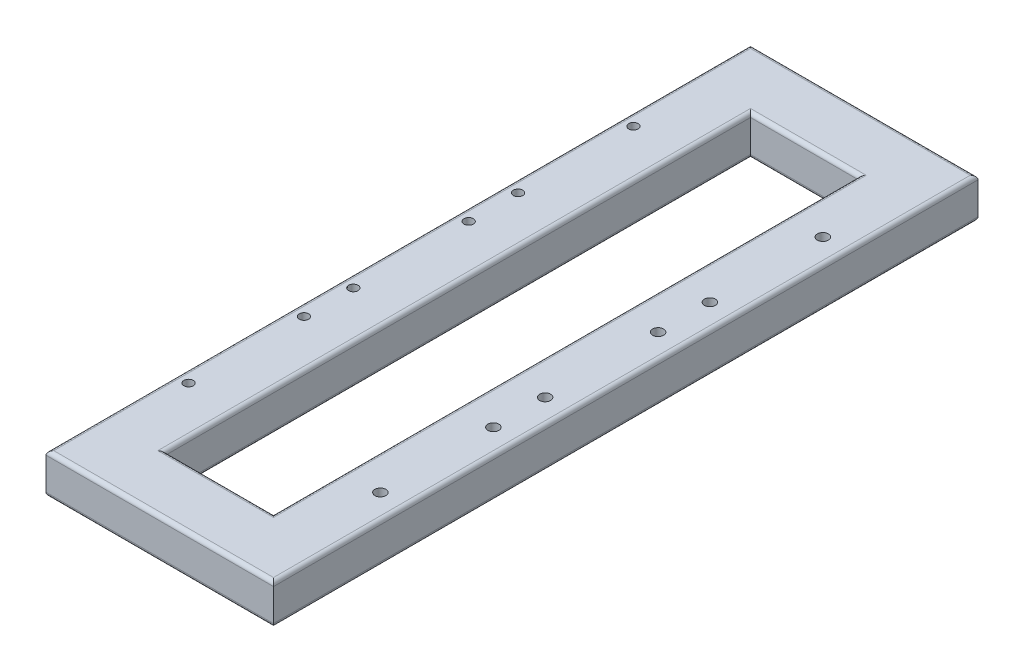
ISO-10303-21;
HEADER;
FILE_DESCRIPTION(('STEP AP214'),'2;1');
FILE_NAME('part.step','',(''),(''),'','','');
FILE_SCHEMA(('AUTOMOTIVE_DESIGN { 1 0 10303 214 1 1 1 1 }'));
ENDSEC;
DATA;
#1=APPLICATION_CONTEXT('core data for automotive mechanical design processes');
#2=APPLICATION_PROTOCOL_DEFINITION('international standard','automotive_design',2000,#1);
#3=PRODUCT_CONTEXT('',#1,'mechanical');
#4=PRODUCT('Part','Part','',(#3));
#5=PRODUCT_RELATED_PRODUCT_CATEGORY('part','',(#4));
#6=PRODUCT_DEFINITION_FORMATION('','',#4);
#7=PRODUCT_DEFINITION_CONTEXT('part definition',#1,'design');
#8=PRODUCT_DEFINITION('design','',#6,#7);
#9=PRODUCT_DEFINITION_SHAPE('','',#8);
#10=(LENGTH_UNIT() NAMED_UNIT(*) SI_UNIT(.MILLI.,.METRE.));
#11=(NAMED_UNIT(*) PLANE_ANGLE_UNIT() SI_UNIT($,.RADIAN.));
#12=(NAMED_UNIT(*) SI_UNIT($,.STERADIAN.) SOLID_ANGLE_UNIT());
#13=UNCERTAINTY_MEASURE_WITH_UNIT(LENGTH_MEASURE(1.E-05),#10,'distance_accuracy_value','');
#14=(GEOMETRIC_REPRESENTATION_CONTEXT(3) GLOBAL_UNCERTAINTY_ASSIGNED_CONTEXT((#13)) GLOBAL_UNIT_ASSIGNED_CONTEXT((#10,
#11,#12)) REPRESENTATION_CONTEXT('',''));
#15=CARTESIAN_POINT('',(0.,0.,0.));
#16=DIRECTION('',(0.,0.,1.));
#17=DIRECTION('',(1.,0.,0.));
#18=AXIS2_PLACEMENT_3D('',#15,#16,#17);
#19=CARTESIAN_POINT('',(0.,50.8,0.));
#20=DIRECTION('',(0.,-1.,0.));
#21=DIRECTION('',(0.,0.,-1.));
#22=AXIS2_PLACEMENT_3D('',#19,#20,#21);
#23=PLANE('',#22);
#24=DIRECTION('',(1.,0.,0.));
#25=VECTOR('',#24,1.);
#26=CARTESIAN_POINT('',(0.,50.8,-5.));
#27=LINE('',#26,#25);
#28=CARTESIAN_POINT('',(-285.,50.8,-5.));
#29=VERTEX_POINT('',#28);
#30=CARTESIAN_POINT('',(-5.,50.8,-5.));
#31=VERTEX_POINT('',#30);
#32=EDGE_CURVE('E176',#29,#31,#27,.T.);
#33=ORIENTED_EDGE('',*,*,#32,.T.);
#34=DIRECTION('',(0.,0.,-1.));
#35=VECTOR('',#34,1.);
#36=CARTESIAN_POINT('',(-5.,50.8,0.));
#37=LINE('',#36,#35);
#38=CARTESIAN_POINT('',(-5.,50.8,-893.));
#39=VERTEX_POINT('',#38);
#40=EDGE_CURVE('E186',#31,#39,#37,.T.);
#41=ORIENTED_EDGE('',*,*,#40,.T.);
#42=DIRECTION('',(-1.,0.,0.));
#43=VECTOR('',#42,1.);
#44=CARTESIAN_POINT('',(0.,50.8,-893.));
#45=LINE('',#44,#43);
#46=CARTESIAN_POINT('',(-285.,50.8,-893.));
#47=VERTEX_POINT('',#46);
#48=EDGE_CURVE('E184',#39,#47,#45,.T.);
#49=ORIENTED_EDGE('',*,*,#48,.T.);
#50=DIRECTION('',(0.,0.,1.));
#51=VECTOR('',#50,1.);
#52=CARTESIAN_POINT('',(-285.,50.8,0.));
#53=LINE('',#52,#51);
#54=EDGE_CURVE('E178',#47,#29,#53,.T.);
#55=ORIENTED_EDGE('',*,*,#54,.T.);
#56=EDGE_LOOP('',(#33,#41,#49,#55));
#57=FACE_BOUND('',#56,.T.);
#58=DIRECTION('',(0.,0.,-1.));
#59=VECTOR('',#58,1.);
#60=CARTESIAN_POINT('',(-71.2,50.8,-76.1999999999997));
#61=LINE('',#60,#59);
#62=CARTESIAN_POINT('',(-71.2,50.8,-826.8));
#63=VERTEX_POINT('',#62);
#64=CARTESIAN_POINT('',(-71.2,50.8,-71.1999999999997));
#65=VERTEX_POINT('',#64);
#66=EDGE_CURVE('E175',#63,#65,#61,.F.);
#67=ORIENTED_EDGE('',*,*,#66,.T.);
#68=DIRECTION('',(1.,0.,0.));
#69=VECTOR('',#68,1.);
#70=CARTESIAN_POINT('',(-213.8,50.8,-71.1999999999997));
#71=LINE('',#70,#69);
#72=CARTESIAN_POINT('',(-218.8,50.8,-71.1999999999997));
#73=VERTEX_POINT('',#72);
#74=EDGE_CURVE('E154',#65,#73,#71,.F.);
#75=ORIENTED_EDGE('',*,*,#74,.T.);
#76=DIRECTION('',(0.,0.,1.));
#77=VECTOR('',#76,1.);
#78=CARTESIAN_POINT('',(-218.8,50.8,-821.8));
#79=LINE('',#78,#77);
#80=CARTESIAN_POINT('',(-218.8,50.8,-826.8));
#81=VERTEX_POINT('',#80);
#82=EDGE_CURVE('E164',#73,#81,#79,.F.);
#83=ORIENTED_EDGE('',*,*,#82,.T.);
#84=DIRECTION('',(-1.,0.,0.));
#85=VECTOR('',#84,1.);
#86=CARTESIAN_POINT('',(-76.2,50.8,-826.8));
#87=LINE('',#86,#85);
#88=EDGE_CURVE('E170',#81,#63,#87,.F.);
#89=ORIENTED_EDGE('',*,*,#88,.T.);
#90=EDGE_LOOP('',(#67,#75,#83,#89));
#91=FACE_BOUND('',#90,.T.);
#92=CARTESIAN_POINT('',(-273.75,50.8,-375.5));
#93=DIRECTION('',(0.,1.,0.));
#94=DIRECTION('',(0.,0.,1.));
#95=AXIS2_PLACEMENT_3D('',#92,#93,#94);
#96=CIRCLE('',#95,5.99999999999999);
#97=CARTESIAN_POINT('',(-273.75,50.8,-369.5));
#98=VERTEX_POINT('',#97);
#99=EDGE_CURVE('E292',#98,#98,#96,.T.);
#100=ORIENTED_EDGE('',*,*,#99,.F.);
#101=EDGE_LOOP('',(#100));
#102=FACE_BOUND('',#101,.T.);
#103=CARTESIAN_POINT('',(-273.75,50.8,-522.5));
#104=DIRECTION('',(0.,1.,0.));
#105=DIRECTION('',(0.,0.,1.));
#106=AXIS2_PLACEMENT_3D('',#103,#104,#105);
#107=CIRCLE('',#106,5.99999999999999);
#108=CARTESIAN_POINT('',(-273.75,50.8,-516.5));
#109=VERTEX_POINT('',#108);
#110=EDGE_CURVE('E392',#109,#109,#107,.T.);
#111=ORIENTED_EDGE('',*,*,#110,.F.);
#112=EDGE_LOOP('',(#111));
#113=FACE_BOUND('',#112,.T.);
#114=CARTESIAN_POINT('',(-30.75,50.8,-377.));
#115=DIRECTION('',(0.,1.,0.));
#116=DIRECTION('',(0.,0.,1.));
#117=AXIS2_PLACEMENT_3D('',#114,#115,#116);
#118=CIRCLE('',#117,6.99999999999999);
#119=CARTESIAN_POINT('',(-30.75,50.8,-370.));
#120=VERTEX_POINT('',#119);
#121=EDGE_CURVE('E388',#120,#120,#118,.T.);
#122=ORIENTED_EDGE('',*,*,#121,.F.);
#123=EDGE_LOOP('',(#122));
#124=FACE_BOUND('',#123,.T.);
#125=CARTESIAN_POINT('',(-30.75,50.8,-521.));
#126=DIRECTION('',(0.,1.,0.));
#127=DIRECTION('',(0.,0.,1.));
#128=AXIS2_PLACEMENT_3D('',#125,#126,#127);
#129=CIRCLE('',#128,6.99999999999999);
#130=CARTESIAN_POINT('',(-30.75,50.8,-514.));
#131=VERTEX_POINT('',#130);
#132=EDGE_CURVE('E384',#131,#131,#129,.T.);
#133=ORIENTED_EDGE('',*,*,#132,.F.);
#134=EDGE_LOOP('',(#133));
#135=FACE_BOUND('',#134,.T.);
#136=CARTESIAN_POINT('',(-30.75,50.8,-311.));
#137=DIRECTION('',(0.,1.,0.));
#138=DIRECTION('',(0.,0.,1.));
#139=AXIS2_PLACEMENT_3D('',#136,#137,#138);
#140=CIRCLE('',#139,6.99999999999999);
#141=CARTESIAN_POINT('',(-30.75,50.8,-304.));
#142=VERTEX_POINT('',#141);
#143=EDGE_CURVE('E380',#142,#142,#140,.T.);
#144=ORIENTED_EDGE('',*,*,#143,.F.);
#145=EDGE_LOOP('',(#144));
#146=FACE_BOUND('',#145,.T.);
#147=CARTESIAN_POINT('',(-273.75,50.8,-165.5));
#148=DIRECTION('',(0.,1.,0.));
#149=DIRECTION('',(0.,0.,1.));
#150=AXIS2_PLACEMENT_3D('',#147,#148,#149);
#151=CIRCLE('',#150,5.99999999999999);
#152=CARTESIAN_POINT('',(-273.75,50.8,-159.5));
#153=VERTEX_POINT('',#152);
#154=EDGE_CURVE('E376',#153,#153,#151,.T.);
#155=ORIENTED_EDGE('',*,*,#154,.F.);
#156=EDGE_LOOP('',(#155));
#157=FACE_BOUND('',#156,.T.);
#158=CARTESIAN_POINT('',(-30.75,50.8,-167.));
#159=DIRECTION('',(0.,1.,0.));
#160=DIRECTION('',(0.,0.,1.));
#161=AXIS2_PLACEMENT_3D('',#158,#159,#160);
#162=CIRCLE('',#161,7.00000000000002);
#163=CARTESIAN_POINT('',(-30.75,50.8,-160.));
#164=VERTEX_POINT('',#163);
#165=EDGE_CURVE('E372',#164,#164,#162,.T.);
#166=ORIENTED_EDGE('',*,*,#165,.F.);
#167=EDGE_LOOP('',(#166));
#168=FACE_BOUND('',#167,.T.);
#169=CARTESIAN_POINT('',(-273.75,50.8,-312.5));
#170=DIRECTION('',(0.,1.,0.));
#171=DIRECTION('',(0.,0.,1.));
#172=AXIS2_PLACEMENT_3D('',#169,#170,#171);
#173=CIRCLE('',#172,5.99999999999999);
#174=CARTESIAN_POINT('',(-273.75,50.8,-306.5));
#175=VERTEX_POINT('',#174);
#176=EDGE_CURVE('E368',#175,#175,#173,.T.);
#177=ORIENTED_EDGE('',*,*,#176,.F.);
#178=EDGE_LOOP('',(#177));
#179=FACE_BOUND('',#178,.T.);
#180=CARTESIAN_POINT('',(-273.75,50.8,-732.5));
#181=DIRECTION('',(0.,1.,0.));
#182=DIRECTION('',(0.,0.,-1.));
#183=AXIS2_PLACEMENT_3D('',#180,#181,#182);
#184=CIRCLE('',#183,5.99999999999999);
#185=CARTESIAN_POINT('',(-273.75,50.8,-738.5));
#186=VERTEX_POINT('',#185);
#187=EDGE_CURVE('E364',#186,#186,#184,.T.);
#188=ORIENTED_EDGE('',*,*,#187,.F.);
#189=EDGE_LOOP('',(#188));
#190=FACE_BOUND('',#189,.T.);
#191=CARTESIAN_POINT('',(-30.75,50.8,-587.));
#192=DIRECTION('',(0.,1.,0.));
#193=DIRECTION('',(0.,0.,-1.));
#194=AXIS2_PLACEMENT_3D('',#191,#192,#193);
#195=CIRCLE('',#194,6.99999999999999);
#196=CARTESIAN_POINT('',(-30.75,50.8,-594.));
#197=VERTEX_POINT('',#196);
#198=EDGE_CURVE('E360',#197,#197,#195,.T.);
#199=ORIENTED_EDGE('',*,*,#198,.F.);
#200=EDGE_LOOP('',(#199));
#201=FACE_BOUND('',#200,.T.);
#202=CARTESIAN_POINT('',(-273.75,50.8,-585.5));
#203=DIRECTION('',(0.,1.,0.));
#204=DIRECTION('',(0.,0.,-1.));
#205=AXIS2_PLACEMENT_3D('',#202,#203,#204);
#206=CIRCLE('',#205,5.99999999999999);
#207=CARTESIAN_POINT('',(-273.75,50.8,-591.5));
#208=VERTEX_POINT('',#207);
#209=EDGE_CURVE('E356',#208,#208,#206,.T.);
#210=ORIENTED_EDGE('',*,*,#209,.F.);
#211=EDGE_LOOP('',(#210));
#212=FACE_BOUND('',#211,.T.);
#213=CARTESIAN_POINT('',(-30.75,50.8,-731.));
#214=DIRECTION('',(0.,1.,0.));
#215=DIRECTION('',(0.,0.,-1.));
#216=AXIS2_PLACEMENT_3D('',#213,#214,#215);
#217=CIRCLE('',#216,7.00000000000002);
#218=CARTESIAN_POINT('',(-30.75,50.8,-738.));
#219=VERTEX_POINT('',#218);
#220=EDGE_CURVE('E351',#219,#219,#217,.T.);
#221=ORIENTED_EDGE('',*,*,#220,.F.);
#222=EDGE_LOOP('',(#221));
#223=FACE_BOUND('',#222,.T.);
#224=ADVANCED_FACE('F33',(#57,#91,#102,#113,#124,#135,#146,#157,#168,#179,#190,#201,#212,#223),
#23,.F.);
#225=CARTESIAN_POINT('',(0.,0.,0.));
#226=DIRECTION('',(0.,-1.,0.));
#227=DIRECTION('',(0.,0.,-1.));
#228=AXIS2_PLACEMENT_3D('',#225,#226,#227);
#229=PLANE('',#228);
#230=DIRECTION('',(0.,0.,1.));
#231=VECTOR('',#230,1.);
#232=CARTESIAN_POINT('',(-285.,0.,-898.));
#233=LINE('',#232,#231);
#234=CARTESIAN_POINT('',(-285.,0.,-5.));
#235=VERTEX_POINT('',#234);
#236=CARTESIAN_POINT('',(-285.,0.,-893.));
#237=VERTEX_POINT('',#236);
#238=EDGE_CURVE('E237',#235,#237,#233,.F.);
#239=ORIENTED_EDGE('',*,*,#238,.T.);
#240=DIRECTION('',(-1.,0.,0.));
#241=VECTOR('',#240,1.);
#242=CARTESIAN_POINT('',(0.,0.,-893.));
#243=LINE('',#242,#241);
#244=CARTESIAN_POINT('',(-5.,0.,-893.));
#245=VERTEX_POINT('',#244);
#246=EDGE_CURVE('E239',#237,#245,#243,.F.);
#247=ORIENTED_EDGE('',*,*,#246,.T.);
#248=DIRECTION('',(0.,0.,-1.));
#249=VECTOR('',#248,1.);
#250=CARTESIAN_POINT('',(-5.,0.,0.));
#251=LINE('',#250,#249);
#252=CARTESIAN_POINT('',(-5.,0.,-5.));
#253=VERTEX_POINT('',#252);
#254=EDGE_CURVE('E235',#245,#253,#251,.F.);
#255=ORIENTED_EDGE('',*,*,#254,.T.);
#256=DIRECTION('',(1.,0.,0.));
#257=VECTOR('',#256,1.);
#258=CARTESIAN_POINT('',(-290.,0.,-5.));
#259=LINE('',#258,#257);
#260=EDGE_CURVE('E233',#253,#235,#259,.F.);
#261=ORIENTED_EDGE('',*,*,#260,.T.);
#262=EDGE_LOOP('',(#239,#247,#255,#261));
#263=FACE_BOUND('',#262,.T.);
#264=DIRECTION('',(0.,0.,1.));
#265=VECTOR('',#264,1.);
#266=CARTESIAN_POINT('',(-218.8,0.,0.));
#267=LINE('',#266,#265);
#268=CARTESIAN_POINT('',(-218.8,0.,-826.8));
#269=VERTEX_POINT('',#268);
#270=CARTESIAN_POINT('',(-218.8,0.,-71.1999999999997));
#271=VERTEX_POINT('',#270);
#272=EDGE_CURVE('E228',#269,#271,#267,.T.);
#273=ORIENTED_EDGE('',*,*,#272,.T.);
#274=DIRECTION('',(1.,0.,0.));
#275=VECTOR('',#274,1.);
#276=CARTESIAN_POINT('',(0.,0.,-71.1999999999997));
#277=LINE('',#276,#275);
#278=CARTESIAN_POINT('',(-71.2,0.,-71.1999999999997));
#279=VERTEX_POINT('',#278);
#280=EDGE_CURVE('E230',#271,#279,#277,.T.);
#281=ORIENTED_EDGE('',*,*,#280,.T.);
#282=DIRECTION('',(0.,0.,-1.));
#283=VECTOR('',#282,1.);
#284=CARTESIAN_POINT('',(-71.2,0.,0.));
#285=LINE('',#284,#283);
#286=CARTESIAN_POINT('',(-71.2,0.,-826.8));
#287=VERTEX_POINT('',#286);
#288=EDGE_CURVE('E224',#279,#287,#285,.T.);
#289=ORIENTED_EDGE('',*,*,#288,.T.);
#290=DIRECTION('',(-1.,0.,0.));
#291=VECTOR('',#290,1.);
#292=CARTESIAN_POINT('',(0.,0.,-826.8));
#293=LINE('',#292,#291);
#294=EDGE_CURVE('E226',#287,#269,#293,.T.);
#295=ORIENTED_EDGE('',*,*,#294,.T.);
#296=EDGE_LOOP('',(#273,#281,#289,#295));
#297=FACE_BOUND('',#296,.T.);
#298=CARTESIAN_POINT('',(-273.75,0.,-585.5));
#299=DIRECTION('',(0.,1.,0.));
#300=DIRECTION('',(0.,0.,-1.));
#301=AXIS2_PLACEMENT_3D('',#298,#299,#300);
#302=CIRCLE('',#301,5.99999999999999);
#303=CARTESIAN_POINT('',(-273.75,0.,-591.5));
#304=VERTEX_POINT('',#303);
#305=EDGE_CURVE('E307',#304,#304,#302,.T.);
#306=ORIENTED_EDGE('',*,*,#305,.T.);
#307=EDGE_LOOP('',(#306));
#308=FACE_BOUND('',#307,.T.);
#309=CARTESIAN_POINT('',(-273.75,0.,-732.5));
#310=DIRECTION('',(0.,1.,0.));
#311=DIRECTION('',(0.,0.,-1.));
#312=AXIS2_PLACEMENT_3D('',#309,#310,#311);
#313=CIRCLE('',#312,5.99999999999999);
#314=CARTESIAN_POINT('',(-273.75,0.,-738.5));
#315=VERTEX_POINT('',#314);
#316=EDGE_CURVE('E311',#315,#315,#313,.T.);
#317=ORIENTED_EDGE('',*,*,#316,.T.);
#318=EDGE_LOOP('',(#317));
#319=FACE_BOUND('',#318,.T.);
#320=CARTESIAN_POINT('',(-30.75,0.,-167.));
#321=DIRECTION('',(0.,1.,0.));
#322=DIRECTION('',(0.,0.,1.));
#323=AXIS2_PLACEMENT_3D('',#320,#321,#322);
#324=CIRCLE('',#323,7.00000000000002);
#325=CARTESIAN_POINT('',(-30.75,0.,-160.));
#326=VERTEX_POINT('',#325);
#327=EDGE_CURVE('E315',#326,#326,#324,.T.);
#328=ORIENTED_EDGE('',*,*,#327,.T.);
#329=EDGE_LOOP('',(#328));
#330=FACE_BOUND('',#329,.T.);
#331=CARTESIAN_POINT('',(-30.75,0.,-311.));
#332=DIRECTION('',(0.,1.,0.));
#333=DIRECTION('',(0.,0.,1.));
#334=AXIS2_PLACEMENT_3D('',#331,#332,#333);
#335=CIRCLE('',#334,6.99999999999999);
#336=CARTESIAN_POINT('',(-30.75,0.,-304.));
#337=VERTEX_POINT('',#336);
#338=EDGE_CURVE('E319',#337,#337,#335,.T.);
#339=ORIENTED_EDGE('',*,*,#338,.T.);
#340=EDGE_LOOP('',(#339));
#341=FACE_BOUND('',#340,.T.);
#342=CARTESIAN_POINT('',(-30.75,0.,-377.));
#343=DIRECTION('',(0.,1.,0.));
#344=DIRECTION('',(0.,0.,1.));
#345=AXIS2_PLACEMENT_3D('',#342,#343,#344);
#346=CIRCLE('',#345,6.99999999999999);
#347=CARTESIAN_POINT('',(-30.75,0.,-370.));
#348=VERTEX_POINT('',#347);
#349=EDGE_CURVE('E323',#348,#348,#346,.T.);
#350=ORIENTED_EDGE('',*,*,#349,.T.);
#351=EDGE_LOOP('',(#350));
#352=FACE_BOUND('',#351,.T.);
#353=CARTESIAN_POINT('',(-273.75,0.,-375.5));
#354=DIRECTION('',(0.,1.,0.));
#355=DIRECTION('',(0.,0.,1.));
#356=AXIS2_PLACEMENT_3D('',#353,#354,#355);
#357=CIRCLE('',#356,5.99999999999999);
#358=CARTESIAN_POINT('',(-273.75,0.,-369.5));
#359=VERTEX_POINT('',#358);
#360=EDGE_CURVE('E327',#359,#359,#357,.T.);
#361=ORIENTED_EDGE('',*,*,#360,.T.);
#362=EDGE_LOOP('',(#361));
#363=FACE_BOUND('',#362,.T.);
#364=CARTESIAN_POINT('',(-273.75,0.,-522.5));
#365=DIRECTION('',(0.,1.,0.));
#366=DIRECTION('',(0.,0.,1.));
#367=AXIS2_PLACEMENT_3D('',#364,#365,#366);
#368=CIRCLE('',#367,5.99999999999999);
#369=CARTESIAN_POINT('',(-273.75,0.,-516.5));
#370=VERTEX_POINT('',#369);
#371=EDGE_CURVE('E331',#370,#370,#368,.T.);
#372=ORIENTED_EDGE('',*,*,#371,.T.);
#373=EDGE_LOOP('',(#372));
#374=FACE_BOUND('',#373,.T.);
#375=CARTESIAN_POINT('',(-30.75,0.,-521.));
#376=DIRECTION('',(0.,1.,0.));
#377=DIRECTION('',(0.,0.,1.));
#378=AXIS2_PLACEMENT_3D('',#375,#376,#377);
#379=CIRCLE('',#378,6.99999999999999);
#380=CARTESIAN_POINT('',(-30.75,0.,-514.));
#381=VERTEX_POINT('',#380);
#382=EDGE_CURVE('E335',#381,#381,#379,.T.);
#383=ORIENTED_EDGE('',*,*,#382,.T.);
#384=EDGE_LOOP('',(#383));
#385=FACE_BOUND('',#384,.T.);
#386=CARTESIAN_POINT('',(-273.75,0.,-165.5));
#387=DIRECTION('',(0.,1.,0.));
#388=DIRECTION('',(0.,0.,1.));
#389=AXIS2_PLACEMENT_3D('',#386,#387,#388);
#390=CIRCLE('',#389,5.99999999999999);
#391=CARTESIAN_POINT('',(-273.75,0.,-159.5));
#392=VERTEX_POINT('',#391);
#393=EDGE_CURVE('E339',#392,#392,#390,.T.);
#394=ORIENTED_EDGE('',*,*,#393,.T.);
#395=EDGE_LOOP('',(#394));
#396=FACE_BOUND('',#395,.T.);
#397=CARTESIAN_POINT('',(-273.75,0.,-312.5));
#398=DIRECTION('',(0.,1.,0.));
#399=DIRECTION('',(0.,0.,1.));
#400=AXIS2_PLACEMENT_3D('',#397,#398,#399);
#401=CIRCLE('',#400,5.99999999999999);
#402=CARTESIAN_POINT('',(-273.75,0.,-306.5));
#403=VERTEX_POINT('',#402);
#404=EDGE_CURVE('E343',#403,#403,#401,.T.);
#405=ORIENTED_EDGE('',*,*,#404,.T.);
#406=EDGE_LOOP('',(#405));
#407=FACE_BOUND('',#406,.T.);
#408=CARTESIAN_POINT('',(-30.75,0.,-587.));
#409=DIRECTION('',(0.,1.,0.));
#410=DIRECTION('',(0.,0.,-1.));
#411=AXIS2_PLACEMENT_3D('',#408,#409,#410);
#412=CIRCLE('',#411,6.99999999999999);
#413=CARTESIAN_POINT('',(-30.75,0.,-594.));
#414=VERTEX_POINT('',#413);
#415=EDGE_CURVE('E347',#414,#414,#412,.T.);
#416=ORIENTED_EDGE('',*,*,#415,.T.);
#417=EDGE_LOOP('',(#416));
#418=FACE_BOUND('',#417,.T.);
#419=CARTESIAN_POINT('',(-30.75,0.,-731.));
#420=DIRECTION('',(0.,1.,0.));
#421=DIRECTION('',(0.,0.,-1.));
#422=AXIS2_PLACEMENT_3D('',#419,#420,#421);
#423=CIRCLE('',#422,7.00000000000002);
#424=CARTESIAN_POINT('',(-30.75,0.,-738.));
#425=VERTEX_POINT('',#424);
#426=EDGE_CURVE('E216',#425,#425,#423,.T.);
#427=ORIENTED_EDGE('',*,*,#426,.T.);
#428=EDGE_LOOP('',(#427));
#429=FACE_BOUND('',#428,.T.);
#430=ADVANCED_FACE('F298',(#263,#297,#308,#319,#330,#341,#352,#363,#374,#385,#396,#407,#418,
#429),#229,.T.);
#431=CARTESIAN_POINT('',(0.,50.8,0.));
#432=DIRECTION('',(-1.,0.,0.));
#433=DIRECTION('',(0.,0.,1.));
#434=AXIS2_PLACEMENT_3D('',#431,#432,#433);
#435=PLANE('',#434);
#436=DIRECTION('',(0.,-1.,0.));
#437=VECTOR('',#436,1.);
#438=CARTESIAN_POINT('',(0.,50.8,0.));
#439=LINE('',#438,#437);
#440=CARTESIAN_POINT('',(0.,45.8,0.));
#441=VERTEX_POINT('',#440);
#442=CARTESIAN_POINT('',(0.,5.,0.));
#443=VERTEX_POINT('',#442);
#444=EDGE_CURVE('E403',#441,#443,#439,.T.);
#445=ORIENTED_EDGE('',*,*,#444,.T.);
#446=DIRECTION('',(0.,0.,-1.));
#447=VECTOR('',#446,1.);
#448=CARTESIAN_POINT('',(0.,5.,-898.));
#449=LINE('',#448,#447);
#450=CARTESIAN_POINT('',(0.,5.,-898.));
#451=VERTEX_POINT('',#450);
#452=EDGE_CURVE('E244',#443,#451,#449,.T.);
#453=ORIENTED_EDGE('',*,*,#452,.T.);
#454=DIRECTION('',(0.,-1.,0.));
#455=VECTOR('',#454,1.);
#456=CARTESIAN_POINT('',(0.,50.8,-898.));
#457=LINE('',#456,#455);
#458=CARTESIAN_POINT('',(0.,45.8,-898.));
#459=VERTEX_POINT('',#458);
#460=EDGE_CURVE('E171',#459,#451,#457,.T.);
#461=ORIENTED_EDGE('',*,*,#460,.F.);
#462=DIRECTION('',(0.,0.,-1.));
#463=VECTOR('',#462,1.);
#464=CARTESIAN_POINT('',(0.,45.8,0.));
#465=LINE('',#464,#463);
#466=EDGE_CURVE('E189',#459,#441,#465,.F.);
#467=ORIENTED_EDGE('',*,*,#466,.T.);
#468=EDGE_LOOP('',(#445,#453,#461,#467));
#469=FACE_BOUND('',#468,.T.);
#470=ADVANCED_FACE('F301',(#469),#435,.F.);
#471=CARTESIAN_POINT('',(-290.,50.8,-898.));
#472=DIRECTION('',(0.,0.,1.));
#473=DIRECTION('',(1.,0.,0.));
#474=AXIS2_PLACEMENT_3D('',#471,#472,#473);
#475=PLANE('',#474);
#476=ORIENTED_EDGE('',*,*,#460,.T.);
#477=DIRECTION('',(-1.,0.,0.));
#478=VECTOR('',#477,1.);
#479=CARTESIAN_POINT('',(-290.,5.,-898.));
#480=LINE('',#479,#478);
#481=CARTESIAN_POINT('',(-290.,5.,-898.));
#482=VERTEX_POINT('',#481);
#483=EDGE_CURVE('E205',#451,#482,#480,.T.);
#484=ORIENTED_EDGE('',*,*,#483,.T.);
#485=DIRECTION('',(0.,-1.,0.));
#486=VECTOR('',#485,1.);
#487=CARTESIAN_POINT('',(-290.,50.8,-898.));
#488=LINE('',#487,#486);
#489=CARTESIAN_POINT('',(-290.,45.8,-898.));
#490=VERTEX_POINT('',#489);
#491=EDGE_CURVE('E409',#490,#482,#488,.T.);
#492=ORIENTED_EDGE('',*,*,#491,.F.);
#493=DIRECTION('',(-1.,0.,0.));
#494=VECTOR('',#493,1.);
#495=CARTESIAN_POINT('',(-290.,45.8,-898.));
#496=LINE('',#495,#494);
#497=EDGE_CURVE('E192',#490,#459,#496,.F.);
#498=ORIENTED_EDGE('',*,*,#497,.T.);
#499=EDGE_LOOP('',(#476,#484,#492,#498));
#500=FACE_BOUND('',#499,.T.);
#501=ADVANCED_FACE('F445',(#500),#475,.F.);
#502=CARTESIAN_POINT('',(-290.,50.8,0.));
#503=DIRECTION('',(1.,0.,0.));
#504=DIRECTION('',(0.,0.,-1.));
#505=AXIS2_PLACEMENT_3D('',#502,#503,#504);
#506=PLANE('',#505);
#507=ORIENTED_EDGE('',*,*,#491,.T.);
#508=DIRECTION('',(0.,0.,1.));
#509=VECTOR('',#508,1.);
#510=CARTESIAN_POINT('',(-290.,5.,0.));
#511=LINE('',#510,#509);
#512=CARTESIAN_POINT('',(-290.,5.,0.));
#513=VERTEX_POINT('',#512);
#514=EDGE_CURVE('E242',#482,#513,#511,.T.);
#515=ORIENTED_EDGE('',*,*,#514,.T.);
#516=DIRECTION('',(0.,-1.,0.));
#517=VECTOR('',#516,1.);
#518=CARTESIAN_POINT('',(-290.,50.8,0.));
#519=LINE('',#518,#517);
#520=CARTESIAN_POINT('',(-290.,45.8,0.));
#521=VERTEX_POINT('',#520);
#522=EDGE_CURVE('E406',#521,#513,#519,.T.);
#523=ORIENTED_EDGE('',*,*,#522,.F.);
#524=DIRECTION('',(0.,0.,1.));
#525=VECTOR('',#524,1.);
#526=CARTESIAN_POINT('',(-290.,45.8,0.));
#527=LINE('',#526,#525);
#528=EDGE_CURVE('E194',#521,#490,#527,.F.);
#529=ORIENTED_EDGE('',*,*,#528,.T.);
#530=EDGE_LOOP('',(#507,#515,#523,#529));
#531=FACE_BOUND('',#530,.T.);
#532=ADVANCED_FACE('F441',(#531),#506,.F.);
#533=CARTESIAN_POINT('',(-290.,50.8,0.));
#534=DIRECTION('',(0.,0.,-1.));
#535=DIRECTION('',(-1.,0.,0.));
#536=AXIS2_PLACEMENT_3D('',#533,#534,#535);
#537=PLANE('',#536);
#538=ORIENTED_EDGE('',*,*,#522,.T.);
#539=DIRECTION('',(1.,0.,0.));
#540=VECTOR('',#539,1.);
#541=CARTESIAN_POINT('',(0.,5.,0.));
#542=LINE('',#541,#540);
#543=EDGE_CURVE('E246',#513,#443,#542,.T.);
#544=ORIENTED_EDGE('',*,*,#543,.T.);
#545=ORIENTED_EDGE('',*,*,#444,.F.);
#546=DIRECTION('',(1.,0.,0.));
#547=VECTOR('',#546,1.);
#548=CARTESIAN_POINT('',(-290.,45.8,0.));
#549=LINE('',#548,#547);
#550=EDGE_CURVE('E196',#441,#521,#549,.F.);
#551=ORIENTED_EDGE('',*,*,#550,.T.);
#552=EDGE_LOOP('',(#538,#544,#545,#551));
#553=FACE_BOUND('',#552,.T.);
#554=ADVANCED_FACE('F438',(#553),#537,.F.);
#555=CARTESIAN_POINT('',(-76.2,50.8,-76.1999999999997));
#556=DIRECTION('',(-1.,0.,0.));
#557=DIRECTION('',(0.,0.,1.));
#558=AXIS2_PLACEMENT_3D('',#555,#556,#557);
#559=PLANE('',#558);
#560=DIRECTION('',(0.,-1.,0.));
#561=VECTOR('',#560,1.);
#562=CARTESIAN_POINT('',(-76.2,50.8,-821.8));
#563=LINE('',#562,#561);
#564=CARTESIAN_POINT('',(-76.2,45.8,-821.8));
#565=VERTEX_POINT('',#564);
#566=CARTESIAN_POINT('',(-76.2,5.,-821.8));
#567=VERTEX_POINT('',#566);
#568=EDGE_CURVE('E286',#565,#567,#563,.T.);
#569=ORIENTED_EDGE('',*,*,#568,.T.);
#570=DIRECTION('',(0.,0.,-1.));
#571=VECTOR('',#570,1.);
#572=CARTESIAN_POINT('',(-76.2,5.,-76.1999999999997));
#573=LINE('',#572,#571);
#574=CARTESIAN_POINT('',(-76.2,5.,-76.1999999999997));
#575=VERTEX_POINT('',#574);
#576=EDGE_CURVE('E11',#567,#575,#573,.F.);
#577=ORIENTED_EDGE('',*,*,#576,.T.);
#578=DIRECTION('',(0.,-1.,0.));
#579=VECTOR('',#578,1.);
#580=CARTESIAN_POINT('',(-76.2,50.8,-76.1999999999997));
#581=LINE('',#580,#579);
#582=CARTESIAN_POINT('',(-76.2,45.8,-76.1999999999997));
#583=VERTEX_POINT('',#582);
#584=EDGE_CURVE('E285',#583,#575,#581,.T.);
#585=ORIENTED_EDGE('',*,*,#584,.F.);
#586=DIRECTION('',(0.,0.,-1.));
#587=VECTOR('',#586,1.);
#588=CARTESIAN_POINT('',(-76.2,45.8,-821.8));
#589=LINE('',#588,#587);
#590=EDGE_CURVE('E199',#583,#565,#589,.T.);
#591=ORIENTED_EDGE('',*,*,#590,.T.);
#592=EDGE_LOOP('',(#569,#577,#585,#591));
#593=FACE_BOUND('',#592,.T.);
#594=ADVANCED_FACE('F284',(#593),#559,.T.);
#595=CARTESIAN_POINT('',(-213.8,50.8,-821.8));
#596=DIRECTION('',(0.,0.,1.));
#597=DIRECTION('',(1.,0.,0.));
#598=AXIS2_PLACEMENT_3D('',#595,#596,#597);
#599=PLANE('',#598);
#600=DIRECTION('',(0.,-1.,0.));
#601=VECTOR('',#600,1.);
#602=CARTESIAN_POINT('',(-213.8,50.8,-821.8));
#603=LINE('',#602,#601);
#604=CARTESIAN_POINT('',(-213.8,45.8,-821.8));
#605=VERTEX_POINT('',#604);
#606=CARTESIAN_POINT('',(-213.8,5.,-821.8));
#607=VERTEX_POINT('',#606);
#608=EDGE_CURVE('E400',#605,#607,#603,.T.);
#609=ORIENTED_EDGE('',*,*,#608,.T.);
#610=DIRECTION('',(-1.,0.,0.));
#611=VECTOR('',#610,1.);
#612=CARTESIAN_POINT('',(-213.8,5.,-821.8));
#613=LINE('',#612,#611);
#614=EDGE_CURVE('E42',#607,#567,#613,.F.);
#615=ORIENTED_EDGE('',*,*,#614,.T.);
#616=ORIENTED_EDGE('',*,*,#568,.F.);
#617=DIRECTION('',(-1.,0.,0.));
#618=VECTOR('',#617,1.);
#619=CARTESIAN_POINT('',(-213.8,45.8,-821.8));
#620=LINE('',#619,#618);
#621=EDGE_CURVE('E201',#565,#605,#620,.T.);
#622=ORIENTED_EDGE('',*,*,#621,.T.);
#623=EDGE_LOOP('',(#609,#615,#616,#622));
#624=FACE_BOUND('',#623,.T.);
#625=ADVANCED_FACE('F420',(#624),#599,.T.);
#626=CARTESIAN_POINT('',(-213.8,50.8,-76.1999999999997));
#627=DIRECTION('',(1.,0.,0.));
#628=DIRECTION('',(0.,0.,-1.));
#629=AXIS2_PLACEMENT_3D('',#626,#627,#628);
#630=PLANE('',#629);
#631=DIRECTION('',(0.,-1.,0.));
#632=VECTOR('',#631,1.);
#633=CARTESIAN_POINT('',(-213.8,50.8,-76.1999999999997));
#634=LINE('',#633,#632);
#635=CARTESIAN_POINT('',(-213.8,45.8,-76.1999999999997));
#636=VERTEX_POINT('',#635);
#637=CARTESIAN_POINT('',(-213.8,5.,-76.1999999999997));
#638=VERTEX_POINT('',#637);
#639=EDGE_CURVE('E291',#636,#638,#634,.T.);
#640=ORIENTED_EDGE('',*,*,#639,.T.);
#641=DIRECTION('',(0.,0.,1.));
#642=VECTOR('',#641,1.);
#643=CARTESIAN_POINT('',(-213.8,5.,-76.1999999999997));
#644=LINE('',#643,#642);
#645=EDGE_CURVE('E57',#638,#607,#644,.F.);
#646=ORIENTED_EDGE('',*,*,#645,.T.);
#647=ORIENTED_EDGE('',*,*,#608,.F.);
#648=DIRECTION('',(0.,0.,1.));
#649=VECTOR('',#648,1.);
#650=CARTESIAN_POINT('',(-213.8,45.8,-76.1999999999997));
#651=LINE('',#650,#649);
#652=EDGE_CURVE('E203',#605,#636,#651,.T.);
#653=ORIENTED_EDGE('',*,*,#652,.T.);
#654=EDGE_LOOP('',(#640,#646,#647,#653));
#655=FACE_BOUND('',#654,.T.);
#656=ADVANCED_FACE('F421',(#655),#630,.T.);
#657=CARTESIAN_POINT('',(-213.8,50.8,-76.1999999999997));
#658=DIRECTION('',(0.,0.,-1.));
#659=DIRECTION('',(-1.,0.,0.));
#660=AXIS2_PLACEMENT_3D('',#657,#658,#659);
#661=PLANE('',#660);
#662=ORIENTED_EDGE('',*,*,#584,.T.);
#663=DIRECTION('',(1.,0.,0.));
#664=VECTOR('',#663,1.);
#665=CARTESIAN_POINT('',(-213.8,5.,-76.1999999999997));
#666=LINE('',#665,#664);
#667=EDGE_CURVE('E248',#575,#638,#666,.F.);
#668=ORIENTED_EDGE('',*,*,#667,.T.);
#669=ORIENTED_EDGE('',*,*,#639,.F.);
#670=DIRECTION('',(1.,0.,0.));
#671=VECTOR('',#670,1.);
#672=CARTESIAN_POINT('',(-76.2,45.8,-76.1999999999997));
#673=LINE('',#672,#671);
#674=EDGE_CURVE('E157',#636,#583,#673,.T.);
#675=ORIENTED_EDGE('',*,*,#674,.T.);
#676=EDGE_LOOP('',(#662,#668,#669,#675));
#677=FACE_BOUND('',#676,.T.);
#678=ADVANCED_FACE('F289',(#677),#661,.T.);
#679=CARTESIAN_POINT('',(-273.75,50.8,-375.5));
#680=DIRECTION('',(0.,-1.,0.));
#681=DIRECTION('',(0.,0.,-1.));
#682=AXIS2_PLACEMENT_3D('',#679,#680,#681);
#683=CYLINDRICAL_SURFACE('',#682,5.99999999999999);
#684=ORIENTED_EDGE('',*,*,#99,.T.);
#685=EDGE_LOOP('',(#684));
#686=FACE_BOUND('',#685,.T.);
#687=ORIENTED_EDGE('',*,*,#360,.F.);
#688=EDGE_LOOP('',(#687));
#689=FACE_BOUND('',#688,.T.);
#690=ADVANCED_FACE('F428',(#686,#689),#683,.F.);
#691=CARTESIAN_POINT('',(-273.75,50.8,-522.5));
#692=DIRECTION('',(0.,-1.,0.));
#693=DIRECTION('',(0.,0.,-1.));
#694=AXIS2_PLACEMENT_3D('',#691,#692,#693);
#695=CYLINDRICAL_SURFACE('',#694,5.99999999999999);
#696=ORIENTED_EDGE('',*,*,#110,.T.);
#697=EDGE_LOOP('',(#696));
#698=FACE_BOUND('',#697,.T.);
#699=ORIENTED_EDGE('',*,*,#371,.F.);
#700=EDGE_LOOP('',(#699));
#701=FACE_BOUND('',#700,.T.);
#702=ADVANCED_FACE('F631',(#698,#701),#695,.F.);
#703=CARTESIAN_POINT('',(-30.75,50.8,-377.));
#704=DIRECTION('',(0.,-1.,0.));
#705=DIRECTION('',(0.,0.,-1.));
#706=AXIS2_PLACEMENT_3D('',#703,#704,#705);
#707=CYLINDRICAL_SURFACE('',#706,6.99999999999999);
#708=ORIENTED_EDGE('',*,*,#121,.T.);
#709=EDGE_LOOP('',(#708));
#710=FACE_BOUND('',#709,.T.);
#711=ORIENTED_EDGE('',*,*,#349,.F.);
#712=EDGE_LOOP('',(#711));
#713=FACE_BOUND('',#712,.T.);
#714=ADVANCED_FACE('F623',(#710,#713),#707,.F.);
#715=CARTESIAN_POINT('',(-30.75,50.8,-521.));
#716=DIRECTION('',(0.,-1.,0.));
#717=DIRECTION('',(0.,0.,-1.));
#718=AXIS2_PLACEMENT_3D('',#715,#716,#717);
#719=CYLINDRICAL_SURFACE('',#718,6.99999999999999);
#720=ORIENTED_EDGE('',*,*,#132,.T.);
#721=EDGE_LOOP('',(#720));
#722=FACE_BOUND('',#721,.T.);
#723=ORIENTED_EDGE('',*,*,#382,.F.);
#724=EDGE_LOOP('',(#723));
#725=FACE_BOUND('',#724,.T.);
#726=ADVANCED_FACE('F615',(#722,#725),#719,.F.);
#727=CARTESIAN_POINT('',(-30.75,50.8,-311.));
#728=DIRECTION('',(0.,-1.,0.));
#729=DIRECTION('',(0.,0.,-1.));
#730=AXIS2_PLACEMENT_3D('',#727,#728,#729);
#731=CYLINDRICAL_SURFACE('',#730,6.99999999999999);
#732=ORIENTED_EDGE('',*,*,#143,.T.);
#733=EDGE_LOOP('',(#732));
#734=FACE_BOUND('',#733,.T.);
#735=ORIENTED_EDGE('',*,*,#338,.F.);
#736=EDGE_LOOP('',(#735));
#737=FACE_BOUND('',#736,.T.);
#738=ADVANCED_FACE('F607',(#734,#737),#731,.F.);
#739=CARTESIAN_POINT('',(-273.75,50.8,-165.5));
#740=DIRECTION('',(0.,-1.,0.));
#741=DIRECTION('',(0.,0.,-1.));
#742=AXIS2_PLACEMENT_3D('',#739,#740,#741);
#743=CYLINDRICAL_SURFACE('',#742,5.99999999999999);
#744=ORIENTED_EDGE('',*,*,#154,.T.);
#745=EDGE_LOOP('',(#744));
#746=FACE_BOUND('',#745,.T.);
#747=ORIENTED_EDGE('',*,*,#393,.F.);
#748=EDGE_LOOP('',(#747));
#749=FACE_BOUND('',#748,.T.);
#750=ADVANCED_FACE('F599',(#746,#749),#743,.F.);
#751=CARTESIAN_POINT('',(-30.75,50.8,-167.));
#752=DIRECTION('',(0.,-1.,0.));
#753=DIRECTION('',(0.,0.,-1.));
#754=AXIS2_PLACEMENT_3D('',#751,#752,#753);
#755=CYLINDRICAL_SURFACE('',#754,7.00000000000002);
#756=ORIENTED_EDGE('',*,*,#165,.T.);
#757=EDGE_LOOP('',(#756));
#758=FACE_BOUND('',#757,.T.);
#759=ORIENTED_EDGE('',*,*,#327,.F.);
#760=EDGE_LOOP('',(#759));
#761=FACE_BOUND('',#760,.T.);
#762=ADVANCED_FACE('F591',(#758,#761),#755,.F.);
#763=CARTESIAN_POINT('',(-273.75,50.8,-312.5));
#764=DIRECTION('',(0.,-1.,0.));
#765=DIRECTION('',(0.,0.,-1.));
#766=AXIS2_PLACEMENT_3D('',#763,#764,#765);
#767=CYLINDRICAL_SURFACE('',#766,5.99999999999999);
#768=ORIENTED_EDGE('',*,*,#176,.T.);
#769=EDGE_LOOP('',(#768));
#770=FACE_BOUND('',#769,.T.);
#771=ORIENTED_EDGE('',*,*,#404,.F.);
#772=EDGE_LOOP('',(#771));
#773=FACE_BOUND('',#772,.T.);
#774=ADVANCED_FACE('F583',(#770,#773),#767,.F.);
#775=CARTESIAN_POINT('',(-273.75,50.8,-732.5));
#776=DIRECTION('',(0.,-1.,0.));
#777=DIRECTION('',(0.,0.,-1.));
#778=AXIS2_PLACEMENT_3D('',#775,#776,#777);
#779=CYLINDRICAL_SURFACE('',#778,5.99999999999999);
#780=ORIENTED_EDGE('',*,*,#187,.T.);
#781=EDGE_LOOP('',(#780));
#782=FACE_BOUND('',#781,.T.);
#783=ORIENTED_EDGE('',*,*,#316,.F.);
#784=EDGE_LOOP('',(#783));
#785=FACE_BOUND('',#784,.T.);
#786=ADVANCED_FACE('F575',(#782,#785),#779,.F.);
#787=CARTESIAN_POINT('',(-30.75,50.8,-587.));
#788=DIRECTION('',(0.,-1.,0.));
#789=DIRECTION('',(0.,0.,-1.));
#790=AXIS2_PLACEMENT_3D('',#787,#788,#789);
#791=CYLINDRICAL_SURFACE('',#790,6.99999999999999);
#792=ORIENTED_EDGE('',*,*,#198,.T.);
#793=EDGE_LOOP('',(#792));
#794=FACE_BOUND('',#793,.T.);
#795=ORIENTED_EDGE('',*,*,#415,.F.);
#796=EDGE_LOOP('',(#795));
#797=FACE_BOUND('',#796,.T.);
#798=ADVANCED_FACE('F567',(#794,#797),#791,.F.);
#799=CARTESIAN_POINT('',(-273.75,50.8,-585.5));
#800=DIRECTION('',(0.,-1.,0.));
#801=DIRECTION('',(0.,0.,-1.));
#802=AXIS2_PLACEMENT_3D('',#799,#800,#801);
#803=CYLINDRICAL_SURFACE('',#802,5.99999999999999);
#804=ORIENTED_EDGE('',*,*,#209,.T.);
#805=EDGE_LOOP('',(#804));
#806=FACE_BOUND('',#805,.T.);
#807=ORIENTED_EDGE('',*,*,#305,.F.);
#808=EDGE_LOOP('',(#807));
#809=FACE_BOUND('',#808,.T.);
#810=ADVANCED_FACE('F559',(#806,#809),#803,.F.);
#811=CARTESIAN_POINT('',(-30.75,50.8,-731.));
#812=DIRECTION('',(0.,-1.,0.));
#813=DIRECTION('',(0.,0.,-1.));
#814=AXIS2_PLACEMENT_3D('',#811,#812,#813);
#815=CYLINDRICAL_SURFACE('',#814,7.00000000000002);
#816=ORIENTED_EDGE('',*,*,#220,.T.);
#817=EDGE_LOOP('',(#816));
#818=FACE_BOUND('',#817,.T.);
#819=ORIENTED_EDGE('',*,*,#426,.F.);
#820=EDGE_LOOP('',(#819));
#821=FACE_BOUND('',#820,.T.);
#822=ADVANCED_FACE('F468',(#818,#821),#815,.F.);
#823=CARTESIAN_POINT('',(-285.,45.8,0.));
#824=DIRECTION('',(0.,0.,1.));
#825=DIRECTION('',(1.,0.,0.));
#826=AXIS2_PLACEMENT_3D('',#823,#824,#825);
#827=CYLINDRICAL_SURFACE('',#826,5.);
#828=CARTESIAN_POINT('',(-285.,45.8,-893.));
#829=DIRECTION('',(-0.707106781186547,0.,0.707106781186547));
#830=DIRECTION('',(0.707106781186547,0.,0.707106781186547));
#831=AXIS2_PLACEMENT_3D('',#828,#829,#830);
#832=ELLIPSE('',#831,7.07106781186547,5.);
#833=EDGE_CURVE('E210',#490,#47,#832,.F.);
#834=ORIENTED_EDGE('',*,*,#833,.F.);
#835=ORIENTED_EDGE('',*,*,#528,.F.);
#836=CARTESIAN_POINT('',(-285.,45.8,-5.));
#837=DIRECTION('',(0.707106781186547,0.,0.707106781186547));
#838=DIRECTION('',(0.707106781186547,0.,-0.707106781186547));
#839=AXIS2_PLACEMENT_3D('',#836,#837,#838);
#840=ELLIPSE('',#839,7.07106781186547,5.);
#841=EDGE_CURVE('E213',#29,#521,#840,.T.);
#842=ORIENTED_EDGE('',*,*,#841,.F.);
#843=ORIENTED_EDGE('',*,*,#54,.F.);
#844=EDGE_LOOP('',(#834,#835,#842,#843));
#845=FACE_BOUND('',#844,.T.);
#846=ADVANCED_FACE('F464',(#845),#827,.T.);
#847=CARTESIAN_POINT('',(0.,45.8,-5.));
#848=DIRECTION('',(1.,0.,0.));
#849=DIRECTION('',(0.,0.,-1.));
#850=AXIS2_PLACEMENT_3D('',#847,#848,#849);
#851=CYLINDRICAL_SURFACE('',#850,5.);
#852=ORIENTED_EDGE('',*,*,#841,.T.);
#853=ORIENTED_EDGE('',*,*,#550,.F.);
#854=CARTESIAN_POINT('',(-5.,45.8,-5.));
#855=DIRECTION('',(0.707106781186547,0.,-0.707106781186547));
#856=DIRECTION('',(0.707106781186547,0.,0.707106781186547));
#857=AXIS2_PLACEMENT_3D('',#854,#855,#856);
#858=ELLIPSE('',#857,7.07106781186547,5.);
#859=EDGE_CURVE('E208',#31,#441,#858,.T.);
#860=ORIENTED_EDGE('',*,*,#859,.F.);
#861=ORIENTED_EDGE('',*,*,#32,.F.);
#862=EDGE_LOOP('',(#852,#853,#860,#861));
#863=FACE_BOUND('',#862,.T.);
#864=ADVANCED_FACE('F460',(#863),#851,.T.);
#865=CARTESIAN_POINT('',(0.,45.8,-893.));
#866=DIRECTION('',(-1.,0.,0.));
#867=DIRECTION('',(0.,0.,1.));
#868=AXIS2_PLACEMENT_3D('',#865,#866,#867);
#869=CYLINDRICAL_SURFACE('',#868,5.);
#870=ORIENTED_EDGE('',*,*,#833,.T.);
#871=ORIENTED_EDGE('',*,*,#48,.F.);
#872=CARTESIAN_POINT('',(-5.,45.8,-893.));
#873=DIRECTION('',(-0.707106781186547,0.,-0.707106781186547));
#874=DIRECTION('',(-0.707106781186547,0.,0.707106781186547));
#875=AXIS2_PLACEMENT_3D('',#872,#873,#874);
#876=ELLIPSE('',#875,7.07106781186547,5.);
#877=EDGE_CURVE('E206',#459,#39,#876,.F.);
#878=ORIENTED_EDGE('',*,*,#877,.F.);
#879=ORIENTED_EDGE('',*,*,#497,.F.);
#880=EDGE_LOOP('',(#870,#871,#878,#879));
#881=FACE_BOUND('',#880,.T.);
#882=ADVANCED_FACE('F456',(#881),#869,.T.);
#883=CARTESIAN_POINT('',(-5.,45.8,0.));
#884=DIRECTION('',(0.,0.,-1.));
#885=DIRECTION('',(-1.,0.,0.));
#886=AXIS2_PLACEMENT_3D('',#883,#884,#885);
#887=CYLINDRICAL_SURFACE('',#886,5.);
#888=ORIENTED_EDGE('',*,*,#859,.T.);
#889=ORIENTED_EDGE('',*,*,#466,.F.);
#890=ORIENTED_EDGE('',*,*,#877,.T.);
#891=ORIENTED_EDGE('',*,*,#40,.F.);
#892=EDGE_LOOP('',(#888,#889,#890,#891));
#893=FACE_BOUND('',#892,.T.);
#894=ADVANCED_FACE('F453',(#893),#887,.T.);
#895=CARTESIAN_POINT('',(-213.8,45.8,-826.8));
#896=DIRECTION('',(1.,0.,0.));
#897=DIRECTION('',(0.,0.,-1.));
#898=AXIS2_PLACEMENT_3D('',#895,#896,#897);
#899=CYLINDRICAL_SURFACE('',#898,5.);
#900=CARTESIAN_POINT('',(-71.2,45.8,-826.8));
#901=DIRECTION('',(0.707106781186547,0.,0.707106781186547));
#902=DIRECTION('',(-0.707106781186547,0.,0.707106781186547));
#903=AXIS2_PLACEMENT_3D('',#900,#901,#902);
#904=ELLIPSE('',#903,7.07106781186547,5.);
#905=EDGE_CURVE('E160',#63,#565,#904,.T.);
#906=ORIENTED_EDGE('',*,*,#905,.F.);
#907=ORIENTED_EDGE('',*,*,#88,.F.);
#908=CARTESIAN_POINT('',(-218.8,45.8,-826.8));
#909=DIRECTION('',(0.707106781186547,0.,-0.707106781186547));
#910=DIRECTION('',(0.707106781186547,0.,0.707106781186547));
#911=AXIS2_PLACEMENT_3D('',#908,#909,#910);
#912=ELLIPSE('',#911,7.07106781186547,5.);
#913=EDGE_CURVE('E167',#605,#81,#912,.F.);
#914=ORIENTED_EDGE('',*,*,#913,.F.);
#915=ORIENTED_EDGE('',*,*,#621,.F.);
#916=EDGE_LOOP('',(#906,#907,#914,#915));
#917=FACE_BOUND('',#916,.T.);
#918=ADVANCED_FACE('F416',(#917),#899,.T.);
#919=CARTESIAN_POINT('',(-218.8,45.8,-76.1999999999997));
#920=DIRECTION('',(0.,0.,-1.));
#921=DIRECTION('',(-1.,0.,0.));
#922=AXIS2_PLACEMENT_3D('',#919,#920,#921);
#923=CYLINDRICAL_SURFACE('',#922,5.);
#924=ORIENTED_EDGE('',*,*,#913,.T.);
#925=ORIENTED_EDGE('',*,*,#82,.F.);
#926=CARTESIAN_POINT('',(-218.8,45.8,-71.1999999999997));
#927=DIRECTION('',(-0.707106781186547,0.,-0.707106781186547));
#928=DIRECTION('',(-0.707106781186547,0.,0.707106781186547));
#929=AXIS2_PLACEMENT_3D('',#926,#927,#928);
#930=ELLIPSE('',#929,7.07106781186547,5.);
#931=EDGE_CURVE('E150',#636,#73,#930,.F.);
#932=ORIENTED_EDGE('',*,*,#931,.F.);
#933=ORIENTED_EDGE('',*,*,#652,.F.);
#934=EDGE_LOOP('',(#924,#925,#932,#933));
#935=FACE_BOUND('',#934,.T.);
#936=ADVANCED_FACE('F165',(#935),#923,.T.);
#937=CARTESIAN_POINT('',(-71.2,45.8,-76.1999999999997));
#938=DIRECTION('',(0.,0.,1.));
#939=DIRECTION('',(1.,0.,0.));
#940=AXIS2_PLACEMENT_3D('',#937,#938,#939);
#941=CYLINDRICAL_SURFACE('',#940,5.);
#942=ORIENTED_EDGE('',*,*,#905,.T.);
#943=ORIENTED_EDGE('',*,*,#590,.F.);
#944=CARTESIAN_POINT('',(-71.2,45.8,-71.1999999999997));
#945=DIRECTION('',(-0.707106781186547,0.,0.707106781186547));
#946=DIRECTION('',(-0.707106781186547,0.,-0.707106781186547));
#947=AXIS2_PLACEMENT_3D('',#944,#945,#946);
#948=ELLIPSE('',#947,7.07106781186547,5.);
#949=EDGE_CURVE('E161',#65,#583,#948,.T.);
#950=ORIENTED_EDGE('',*,*,#949,.F.);
#951=ORIENTED_EDGE('',*,*,#66,.F.);
#952=EDGE_LOOP('',(#942,#943,#950,#951));
#953=FACE_BOUND('',#952,.T.);
#954=ADVANCED_FACE('F419',(#953),#941,.T.);
#955=CARTESIAN_POINT('',(-213.8,45.8,-71.1999999999997));
#956=DIRECTION('',(-1.,0.,0.));
#957=DIRECTION('',(0.,0.,1.));
#958=AXIS2_PLACEMENT_3D('',#955,#956,#957);
#959=CYLINDRICAL_SURFACE('',#958,5.);
#960=ORIENTED_EDGE('',*,*,#931,.T.);
#961=ORIENTED_EDGE('',*,*,#74,.F.);
#962=ORIENTED_EDGE('',*,*,#949,.T.);
#963=ORIENTED_EDGE('',*,*,#674,.F.);
#964=EDGE_LOOP('',(#960,#961,#962,#963));
#965=FACE_BOUND('',#964,.T.);
#966=ADVANCED_FACE('F152',(#965),#959,.T.);
#967=CARTESIAN_POINT('',(-290.,5.,-5.));
#968=DIRECTION('',(-1.,0.,0.));
#969=DIRECTION('',(0.,0.,1.));
#970=AXIS2_PLACEMENT_3D('',#967,#968,#969);
#971=CYLINDRICAL_SURFACE('',#970,5.);
#972=CARTESIAN_POINT('',(-285.,5.,-5.));
#973=DIRECTION('',(-0.707106781186547,0.,-0.707106781186547));
#974=DIRECTION('',(-0.707106781186547,0.,0.707106781186547));
#975=AXIS2_PLACEMENT_3D('',#972,#973,#974);
#976=ELLIPSE('',#975,7.07106781186547,5.);
#977=EDGE_CURVE('E257',#235,#513,#976,.T.);
#978=ORIENTED_EDGE('',*,*,#977,.F.);
#979=ORIENTED_EDGE('',*,*,#260,.F.);
#980=CARTESIAN_POINT('',(-5.,5.,-5.));
#981=DIRECTION('',(-0.707106781186547,0.,0.707106781186547));
#982=DIRECTION('',(-0.707106781186547,0.,-0.707106781186547));
#983=AXIS2_PLACEMENT_3D('',#980,#981,#982);
#984=ELLIPSE('',#983,7.07106781186547,5.);
#985=EDGE_CURVE('E217',#443,#253,#984,.F.);
#986=ORIENTED_EDGE('',*,*,#985,.F.);
#987=ORIENTED_EDGE('',*,*,#543,.F.);
#988=EDGE_LOOP('',(#978,#979,#986,#987));
#989=FACE_BOUND('',#988,.T.);
#990=ADVANCED_FACE('F472',(#989),#971,.T.);
#991=CARTESIAN_POINT('',(-5.,5.,0.));
#992=DIRECTION('',(0.,0.,1.));
#993=DIRECTION('',(1.,0.,0.));
#994=AXIS2_PLACEMENT_3D('',#991,#992,#993);
#995=CYLINDRICAL_SURFACE('',#994,5.);
#996=ORIENTED_EDGE('',*,*,#985,.T.);
#997=ORIENTED_EDGE('',*,*,#254,.F.);
#998=CARTESIAN_POINT('',(-5.,5.,-893.));
#999=DIRECTION('',(0.707106781186547,0.,0.707106781186547));
#1000=DIRECTION('',(-0.707106781186547,0.,0.707106781186547));
#1001=AXIS2_PLACEMENT_3D('',#998,#999,#1000);
#1002=ELLIPSE('',#1001,7.07106781186547,5.);
#1003=EDGE_CURVE('E255',#451,#245,#1002,.F.);
#1004=ORIENTED_EDGE('',*,*,#1003,.F.);
#1005=ORIENTED_EDGE('',*,*,#452,.F.);
#1006=EDGE_LOOP('',(#996,#997,#1004,#1005));
#1007=FACE_BOUND('',#1006,.T.);
#1008=ADVANCED_FACE('F486',(#1007),#995,.T.);
#1009=CARTESIAN_POINT('',(-285.,5.,0.));
#1010=DIRECTION('',(0.,0.,-1.));
#1011=DIRECTION('',(-1.,0.,0.));
#1012=AXIS2_PLACEMENT_3D('',#1009,#1010,#1011);
#1013=CYLINDRICAL_SURFACE('',#1012,5.);
#1014=ORIENTED_EDGE('',*,*,#977,.T.);
#1015=ORIENTED_EDGE('',*,*,#514,.F.);
#1016=CARTESIAN_POINT('',(-285.,5.,-893.));
#1017=DIRECTION('',(0.707106781186547,0.,-0.707106781186547));
#1018=DIRECTION('',(-0.707106781186547,0.,-0.707106781186547));
#1019=AXIS2_PLACEMENT_3D('',#1016,#1017,#1018);
#1020=ELLIPSE('',#1019,7.07106781186547,5.);
#1021=EDGE_CURVE('E253',#237,#482,#1020,.T.);
#1022=ORIENTED_EDGE('',*,*,#1021,.F.);
#1023=ORIENTED_EDGE('',*,*,#238,.F.);
#1024=EDGE_LOOP('',(#1014,#1015,#1022,#1023));
#1025=FACE_BOUND('',#1024,.T.);
#1026=ADVANCED_FACE('F482',(#1025),#1013,.T.);
#1027=CARTESIAN_POINT('',(-290.,5.,-893.));
#1028=DIRECTION('',(1.,0.,0.));
#1029=DIRECTION('',(0.,0.,-1.));
#1030=AXIS2_PLACEMENT_3D('',#1027,#1028,#1029);
#1031=CYLINDRICAL_SURFACE('',#1030,5.);
#1032=ORIENTED_EDGE('',*,*,#1003,.T.);
#1033=ORIENTED_EDGE('',*,*,#246,.F.);
#1034=ORIENTED_EDGE('',*,*,#1021,.T.);
#1035=ORIENTED_EDGE('',*,*,#483,.F.);
#1036=EDGE_LOOP('',(#1032,#1033,#1034,#1035));
#1037=FACE_BOUND('',#1036,.T.);
#1038=ADVANCED_FACE('F479',(#1037),#1031,.T.);
#1039=CARTESIAN_POINT('',(0.,5.,-826.8));
#1040=DIRECTION('',(-1.,0.,0.));
#1041=DIRECTION('',(0.,0.,1.));
#1042=AXIS2_PLACEMENT_3D('',#1039,#1040,#1041);
#1043=CYLINDRICAL_SURFACE('',#1042,5.);
#1044=CARTESIAN_POINT('',(-71.2,5.,-826.8));
#1045=DIRECTION('',(-0.707106781186547,0.,-0.707106781186547));
#1046=DIRECTION('',(-0.707106781186547,0.,0.707106781186547));
#1047=AXIS2_PLACEMENT_3D('',#1044,#1045,#1046);
#1048=ELLIPSE('',#1047,7.07106781186547,5.);
#1049=EDGE_CURVE('E265',#567,#287,#1048,.F.);
#1050=ORIENTED_EDGE('',*,*,#1049,.F.);
#1051=ORIENTED_EDGE('',*,*,#614,.F.);
#1052=CARTESIAN_POINT('',(-218.8,5.,-826.8));
#1053=DIRECTION('',(-0.707106781186547,0.,0.707106781186547));
#1054=DIRECTION('',(0.707106781186547,0.,0.707106781186547));
#1055=AXIS2_PLACEMENT_3D('',#1052,#1053,#1054);
#1056=ELLIPSE('',#1055,7.07106781186547,5.);
#1057=EDGE_CURVE('E37',#269,#607,#1056,.T.);
#1058=ORIENTED_EDGE('',*,*,#1057,.F.);
#1059=ORIENTED_EDGE('',*,*,#294,.F.);
#1060=EDGE_LOOP('',(#1050,#1051,#1058,#1059));
#1061=FACE_BOUND('',#1060,.T.);
#1062=ADVANCED_FACE('F35',(#1061),#1043,.T.);
#1063=CARTESIAN_POINT('',(-218.8,5.,0.));
#1064=DIRECTION('',(0.,0.,1.));
#1065=DIRECTION('',(1.,0.,0.));
#1066=AXIS2_PLACEMENT_3D('',#1063,#1064,#1065);
#1067=CYLINDRICAL_SURFACE('',#1066,5.);
#1068=ORIENTED_EDGE('',*,*,#1057,.T.);
#1069=ORIENTED_EDGE('',*,*,#645,.F.);
#1070=CARTESIAN_POINT('',(-218.8,5.,-71.1999999999997));
#1071=DIRECTION('',(0.707106781186547,0.,0.707106781186547));
#1072=DIRECTION('',(0.707106781186547,0.,-0.707106781186547));
#1073=AXIS2_PLACEMENT_3D('',#1070,#1071,#1072);
#1074=ELLIPSE('',#1073,7.07106781186547,5.);
#1075=EDGE_CURVE('E264',#271,#638,#1074,.T.);
#1076=ORIENTED_EDGE('',*,*,#1075,.F.);
#1077=ORIENTED_EDGE('',*,*,#272,.F.);
#1078=EDGE_LOOP('',(#1068,#1069,#1076,#1077));
#1079=FACE_BOUND('',#1078,.T.);
#1080=ADVANCED_FACE('F275',(#1079),#1067,.T.);
#1081=CARTESIAN_POINT('',(-71.2,5.,0.));
#1082=DIRECTION('',(0.,0.,-1.));
#1083=DIRECTION('',(-1.,0.,0.));
#1084=AXIS2_PLACEMENT_3D('',#1081,#1082,#1083);
#1085=CYLINDRICAL_SURFACE('',#1084,5.);
#1086=ORIENTED_EDGE('',*,*,#1049,.T.);
#1087=ORIENTED_EDGE('',*,*,#288,.F.);
#1088=CARTESIAN_POINT('',(-71.2,5.,-71.1999999999997));
#1089=DIRECTION('',(0.707106781186547,0.,-0.707106781186547));
#1090=DIRECTION('',(0.707106781186547,0.,0.707106781186547));
#1091=AXIS2_PLACEMENT_3D('',#1088,#1089,#1090);
#1092=ELLIPSE('',#1091,7.07106781186547,5.);
#1093=EDGE_CURVE('E262',#575,#279,#1092,.F.);
#1094=ORIENTED_EDGE('',*,*,#1093,.F.);
#1095=ORIENTED_EDGE('',*,*,#576,.F.);
#1096=EDGE_LOOP('',(#1086,#1087,#1094,#1095));
#1097=FACE_BOUND('',#1096,.T.);
#1098=ADVANCED_FACE('F280',(#1097),#1085,.T.);
#1099=CARTESIAN_POINT('',(0.,5.,-71.1999999999997));
#1100=DIRECTION('',(1.,0.,0.));
#1101=DIRECTION('',(0.,0.,-1.));
#1102=AXIS2_PLACEMENT_3D('',#1099,#1100,#1101);
#1103=CYLINDRICAL_SURFACE('',#1102,5.);
#1104=ORIENTED_EDGE('',*,*,#1075,.T.);
#1105=ORIENTED_EDGE('',*,*,#667,.F.);
#1106=ORIENTED_EDGE('',*,*,#1093,.T.);
#1107=ORIENTED_EDGE('',*,*,#280,.F.);
#1108=EDGE_LOOP('',(#1104,#1105,#1106,#1107));
#1109=FACE_BOUND('',#1108,.T.);
#1110=ADVANCED_FACE('F295',(#1109),#1103,.T.);
#1111=CLOSED_SHELL('',(#224,#430,#470,#501,#532,#554,#594,#625,#656,#678,#690,#702,#714,#726,
#738,#750,#762,#774,#786,#798,#810,#822,#846,#864,#882,#894,#918,#936,#954,#966,#990,#1008,
#1026,#1038,#1062,#1080,#1098,#1110));
#1112=MANIFOLD_SOLID_BREP('B2',#1111);
#1113=ADVANCED_BREP_SHAPE_REPRESENTATION('',(#18,#1112),#14);
#1114=SHAPE_DEFINITION_REPRESENTATION(#9,#1113);
ENDSEC;
END-ISO-10303-21;
